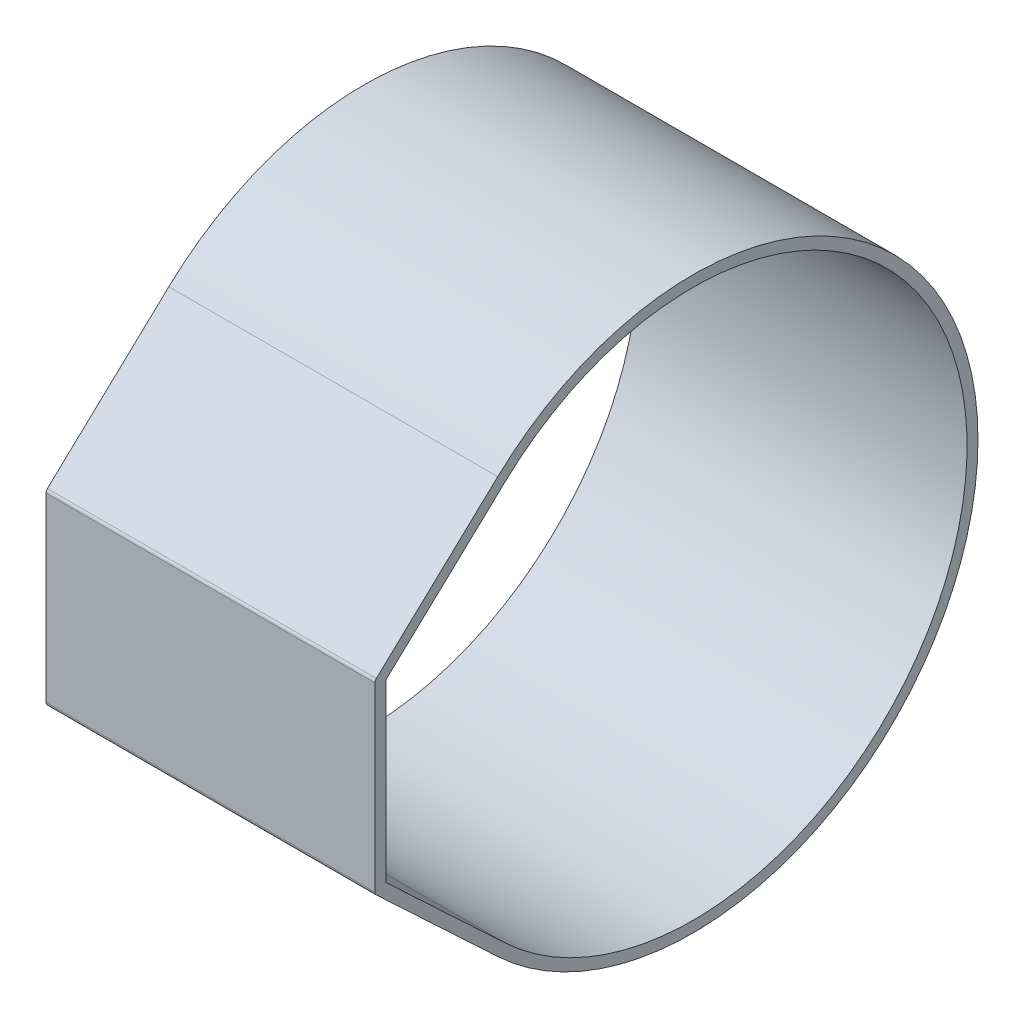
ISO-10303-21;
HEADER;
FILE_DESCRIPTION(('STEP AP214'),'2;1');
FILE_NAME('part.step','',(''),(''),'','','');
FILE_SCHEMA(('AUTOMOTIVE_DESIGN { 1 0 10303 214 1 1 1 1 }'));
ENDSEC;
DATA;
#1=APPLICATION_CONTEXT('core data for automotive mechanical design processes');
#2=APPLICATION_PROTOCOL_DEFINITION('international standard','automotive_design',2000,#1);
#3=PRODUCT_CONTEXT('',#1,'mechanical');
#4=PRODUCT('Part','Part','',(#3));
#5=PRODUCT_RELATED_PRODUCT_CATEGORY('part','',(#4));
#6=PRODUCT_DEFINITION_FORMATION('','',#4);
#7=PRODUCT_DEFINITION_CONTEXT('part definition',#1,'design');
#8=PRODUCT_DEFINITION('design','',#6,#7);
#9=PRODUCT_DEFINITION_SHAPE('','',#8);
#10=(LENGTH_UNIT() NAMED_UNIT(*) SI_UNIT(.MILLI.,.METRE.));
#11=(NAMED_UNIT(*) PLANE_ANGLE_UNIT() SI_UNIT($,.RADIAN.));
#12=(NAMED_UNIT(*) SI_UNIT($,.STERADIAN.) SOLID_ANGLE_UNIT());
#13=UNCERTAINTY_MEASURE_WITH_UNIT(LENGTH_MEASURE(1.E-05),#10,'distance_accuracy_value','');
#14=(GEOMETRIC_REPRESENTATION_CONTEXT(3) GLOBAL_UNCERTAINTY_ASSIGNED_CONTEXT((#13)) GLOBAL_UNIT_ASSIGNED_CONTEXT((#10,
#11,#12)) REPRESENTATION_CONTEXT('',''));
#15=CARTESIAN_POINT('',(0.,0.,0.));
#16=DIRECTION('',(0.,0.,1.));
#17=DIRECTION('',(1.,0.,0.));
#18=AXIS2_PLACEMENT_3D('',#15,#16,#17);
#19=CARTESIAN_POINT('',(139.007123161513,663.202201807785,-372.057743681072));
#20=DIRECTION('',(1.,0.,0.));
#21=DIRECTION('',(0.,1.,0.));
#22=AXIS2_PLACEMENT_3D('',#19,#20,#21);
#23=CYLINDRICAL_SURFACE('',#22,0.2);
#24=CARTESIAN_POINT('',(139.007123161513,663.202201807785,-372.057743681072));
#25=DIRECTION('',(1.,0.,0.));
#26=DIRECTION('',(0.,1.,0.));
#27=AXIS2_PLACEMENT_3D('',#24,#25,#26);
#28=CIRCLE('',#27,0.2);
#29=CARTESIAN_POINT('',(139.007123161513,663.202201807785,-371.857743681072));
#30=VERTEX_POINT('',#29);
#31=CARTESIAN_POINT('',(139.007123161513,663.056416626972,-371.920825161304));
#32=VERTEX_POINT('',#31);
#33=EDGE_CURVE('E20',#30,#32,#28,.T.);
#34=ORIENTED_EDGE('',*,*,#33,.T.);
#35=DIRECTION('',(1.,0.,0.));
#36=VECTOR('',#35,1.);
#37=CARTESIAN_POINT('',(139.007123161513,663.056416626972,-371.920825161304));
#38=LINE('',#37,#36);
#39=CARTESIAN_POINT('',(154.007123161513,663.056416626972,-371.920825161304));
#40=VERTEX_POINT('',#39);
#41=EDGE_CURVE('E88',#40,#32,#38,.F.);
#42=ORIENTED_EDGE('',*,*,#41,.F.);
#43=CARTESIAN_POINT('',(154.007123161513,663.202201807785,-372.057743681072));
#44=DIRECTION('',(1.,0.,0.));
#45=DIRECTION('',(0.,1.,0.));
#46=AXIS2_PLACEMENT_3D('',#43,#44,#45);
#47=CIRCLE('',#46,0.2);
#48=CARTESIAN_POINT('',(154.007123161513,663.202201807785,-371.857743681072));
#49=VERTEX_POINT('',#48);
#50=EDGE_CURVE('E136',#40,#49,#47,.F.);
#51=ORIENTED_EDGE('',*,*,#50,.T.);
#52=DIRECTION('',(1.,0.,0.));
#53=VECTOR('',#52,1.);
#54=CARTESIAN_POINT('',(139.007123161513,663.202201807785,-371.857743681072));
#55=LINE('',#54,#53);
#56=EDGE_CURVE('E91',#30,#49,#55,.T.);
#57=ORIENTED_EDGE('',*,*,#56,.F.);
#58=EDGE_LOOP('',(#34,#42,#51,#57));
#59=FACE_BOUND('',#58,.T.);
#60=ADVANCED_FACE('F17',(#59),#23,.T.);
#61=CARTESIAN_POINT('',(139.007123161513,663.11566148883,-371.857743681072));
#62=DIRECTION('',(0.,0.,1.));
#63=DIRECTION('',(1.,0.,0.));
#64=AXIS2_PLACEMENT_3D('',#61,#62,#63);
#65=PLANE('',#64);
#66=DIRECTION('',(0.,1.,0.));
#67=VECTOR('',#66,1.);
#68=CARTESIAN_POINT('',(139.007123161513,667.332012286217,-371.857743681072));
#69=LINE('',#68,#67);
#70=CARTESIAN_POINT('',(139.007123161513,671.46182276465,-371.857743681072));
#71=VERTEX_POINT('',#70);
#72=EDGE_CURVE('E98',#30,#71,#69,.T.);
#73=ORIENTED_EDGE('',*,*,#72,.F.);
#74=ORIENTED_EDGE('',*,*,#56,.T.);
#75=DIRECTION('',(0.,1.,0.));
#76=VECTOR('',#75,1.);
#77=CARTESIAN_POINT('',(154.007123161513,667.332012286217,-371.857743681072));
#78=LINE('',#77,#76);
#79=CARTESIAN_POINT('',(154.007123161513,671.46182276465,-371.857743681072));
#80=VERTEX_POINT('',#79);
#81=EDGE_CURVE('E133',#49,#80,#78,.T.);
#82=ORIENTED_EDGE('',*,*,#81,.T.);
#83=DIRECTION('',(1.,0.,0.));
#84=VECTOR('',#83,1.);
#85=CARTESIAN_POINT('',(139.007123161513,671.46182276465,-371.857743681072));
#86=LINE('',#85,#84);
#87=EDGE_CURVE('E148',#71,#80,#86,.T.);
#88=ORIENTED_EDGE('',*,*,#87,.F.);
#89=EDGE_LOOP('',(#73,#74,#82,#88));
#90=FACE_BOUND('',#89,.T.);
#91=ADVANCED_FACE('F176',(#90),#65,.T.);
#92=CARTESIAN_POINT('',(139.007123161513,663.332012286217,-372.357743681072));
#93=DIRECTION('',(0.,0.,1.));
#94=DIRECTION('',(1.,0.,0.));
#95=AXIS2_PLACEMENT_3D('',#92,#93,#94);
#96=PLANE('',#95);
#97=DIRECTION('',(1.,0.,0.));
#98=VECTOR('',#97,1.);
#99=CARTESIAN_POINT('',(139.007123161513,663.332012286217,-372.357743681072));
#100=LINE('',#99,#98);
#101=CARTESIAN_POINT('',(154.007123161513,663.332012286217,-372.357743681072));
#102=VERTEX_POINT('',#101);
#103=CARTESIAN_POINT('',(139.007123161513,663.332012286217,-372.357743681072));
#104=VERTEX_POINT('',#103);
#105=EDGE_CURVE('E154',#102,#104,#100,.F.);
#106=ORIENTED_EDGE('',*,*,#105,.T.);
#107=DIRECTION('',(0.,1.,0.));
#108=VECTOR('',#107,1.);
#109=CARTESIAN_POINT('',(139.007123161513,667.332012286217,-372.357743681072));
#110=LINE('',#109,#108);
#111=CARTESIAN_POINT('',(139.007123161513,671.332012286217,-372.357743681072));
#112=VERTEX_POINT('',#111);
#113=EDGE_CURVE('E103',#112,#104,#110,.F.);
#114=ORIENTED_EDGE('',*,*,#113,.F.);
#115=DIRECTION('',(1.,0.,0.));
#116=VECTOR('',#115,1.);
#117=CARTESIAN_POINT('',(139.007123161513,671.332012286217,-372.357743681072));
#118=LINE('',#117,#116);
#119=CARTESIAN_POINT('',(154.007123161513,671.332012286217,-372.357743681072));
#120=VERTEX_POINT('',#119);
#121=EDGE_CURVE('E144',#112,#120,#118,.T.);
#122=ORIENTED_EDGE('',*,*,#121,.T.);
#123=DIRECTION('',(0.,1.,0.));
#124=VECTOR('',#123,1.);
#125=CARTESIAN_POINT('',(154.007123161513,667.332012286217,-372.357743681072));
#126=LINE('',#125,#124);
#127=EDGE_CURVE('E130',#120,#102,#126,.F.);
#128=ORIENTED_EDGE('',*,*,#127,.T.);
#129=EDGE_LOOP('',(#106,#114,#122,#128));
#130=FACE_BOUND('',#129,.T.);
#131=ADVANCED_FACE('F217',(#130),#96,.F.);
#132=CARTESIAN_POINT('',(139.007123161513,658.220438485423,-377.800336195585));
#133=DIRECTION('',(0.,-0.728925904063566,0.684592598838983));
#134=DIRECTION('',(0.,-0.684592598838983,-0.728925904063566));
#135=AXIS2_PLACEMENT_3D('',#132,#133,#134);
#136=PLANE('',#135);
#137=DIRECTION('',(1.,0.,0.));
#138=VECTOR('',#137,1.);
#139=CARTESIAN_POINT('',(139.007123161513,658.220438485423,-377.800336195585));
#140=LINE('',#139,#138);
#141=CARTESIAN_POINT('',(154.007123161513,658.220438485422,-377.800336195585));
#142=VERTEX_POINT('',#141);
#143=CARTESIAN_POINT('',(139.007123161513,658.220438485422,-377.800336195585));
#144=VERTEX_POINT('',#143);
#145=EDGE_CURVE('E145',#142,#144,#140,.F.);
#146=ORIENTED_EDGE('',*,*,#145,.T.);
#147=DIRECTION('',(0.,-0.684592598838925,-0.728925904063621));
#148=VECTOR('',#147,1.);
#149=CARTESIAN_POINT('',(139.007123161513,663.332012286217,-372.357743681072));
#150=LINE('',#149,#148);
#151=EDGE_CURVE('E107',#104,#144,#150,.T.);
#152=ORIENTED_EDGE('',*,*,#151,.F.);
#153=ORIENTED_EDGE('',*,*,#105,.F.);
#154=DIRECTION('',(0.,-0.684592598838925,-0.728925904063621));
#155=VECTOR('',#154,1.);
#156=CARTESIAN_POINT('',(154.007123161513,663.332012286217,-372.357743681072));
#157=LINE('',#156,#155);
#158=EDGE_CURVE('E128',#102,#142,#157,.T.);
#159=ORIENTED_EDGE('',*,*,#158,.T.);
#160=EDGE_LOOP('',(#146,#152,#153,#159));
#161=FACE_BOUND('',#160,.T.);
#162=ADVANCED_FACE('F213',(#161),#136,.F.);
#163=CARTESIAN_POINT('',(139.007123161513,667.332012286217,-386.357743681072));
#164=DIRECTION('',(1.,0.,0.));
#165=DIRECTION('',(0.,1.,0.));
#166=AXIS2_PLACEMENT_3D('',#163,#164,#165);
#167=CYLINDRICAL_SURFACE('',#166,12.4999999999999);
#168=DIRECTION('',(1.,0.,0.));
#169=VECTOR('',#168,1.);
#170=CARTESIAN_POINT('',(139.007123161513,676.443586087012,-377.800336195585));
#171=LINE('',#170,#169);
#172=CARTESIAN_POINT('',(154.007123161513,676.443586087012,-377.800336195585));
#173=VERTEX_POINT('',#172);
#174=CARTESIAN_POINT('',(139.007123161513,676.443586087012,-377.800336195585));
#175=VERTEX_POINT('',#174);
#176=EDGE_CURVE('E142',#173,#175,#171,.F.);
#177=ORIENTED_EDGE('',*,*,#176,.T.);
#178=CARTESIAN_POINT('',(139.007123161513,667.332012286217,-386.357743681072));
#179=DIRECTION('',(1.,0.,0.));
#180=DIRECTION('',(0.,1.,0.));
#181=AXIS2_PLACEMENT_3D('',#178,#179,#180);
#182=CIRCLE('',#181,12.4999999999999);
#183=EDGE_CURVE('E169',#144,#175,#182,.T.);
#184=ORIENTED_EDGE('',*,*,#183,.F.);
#185=ORIENTED_EDGE('',*,*,#145,.F.);
#186=CARTESIAN_POINT('',(154.007123161513,667.332012286217,-386.357743681072));
#187=DIRECTION('',(1.,0.,0.));
#188=DIRECTION('',(0.,1.,0.));
#189=AXIS2_PLACEMENT_3D('',#186,#187,#188);
#190=CIRCLE('',#189,12.4999999999999);
#191=EDGE_CURVE('E125',#142,#173,#190,.T.);
#192=ORIENTED_EDGE('',*,*,#191,.T.);
#193=EDGE_LOOP('',(#177,#184,#185,#192));
#194=FACE_BOUND('',#193,.T.);
#195=ADVANCED_FACE('F209',(#194),#167,.F.);
#196=CARTESIAN_POINT('',(139.007123161513,671.332012286217,-372.357743681072));
#197=DIRECTION('',(0.,0.728925904063566,0.684592598838983));
#198=DIRECTION('',(0.,-0.684592598838983,0.728925904063566));
#199=AXIS2_PLACEMENT_3D('',#196,#197,#198);
#200=PLANE('',#199);
#201=ORIENTED_EDGE('',*,*,#121,.F.);
#202=DIRECTION('',(0.,-0.684592598838988,0.728925904063562));
#203=VECTOR('',#202,1.);
#204=CARTESIAN_POINT('',(139.007123161513,676.443586087012,-377.800336195585));
#205=LINE('',#204,#203);
#206=EDGE_CURVE('E139',#175,#112,#205,.T.);
#207=ORIENTED_EDGE('',*,*,#206,.F.);
#208=ORIENTED_EDGE('',*,*,#176,.F.);
#209=DIRECTION('',(0.,-0.684592598838988,0.728925904063562));
#210=VECTOR('',#209,1.);
#211=CARTESIAN_POINT('',(154.007123161513,676.443586087012,-377.800336195585));
#212=LINE('',#211,#210);
#213=EDGE_CURVE('E122',#173,#120,#212,.T.);
#214=ORIENTED_EDGE('',*,*,#213,.T.);
#215=EDGE_LOOP('',(#201,#207,#208,#214));
#216=FACE_BOUND('',#215,.T.);
#217=ADVANCED_FACE('F206',(#216),#200,.F.);
#218=CARTESIAN_POINT('',(139.007123161513,671.46182276465,-372.057743681072));
#219=DIRECTION('',(1.,0.,0.));
#220=DIRECTION('',(0.,1.,0.));
#221=AXIS2_PLACEMENT_3D('',#218,#219,#220);
#222=CYLINDRICAL_SURFACE('',#221,0.2);
#223=CARTESIAN_POINT('',(139.007123161513,671.46182276465,-372.057743681072));
#224=DIRECTION('',(1.,0.,0.));
#225=DIRECTION('',(0.,1.,0.));
#226=AXIS2_PLACEMENT_3D('',#223,#224,#225);
#227=CIRCLE('',#226,0.2);
#228=CARTESIAN_POINT('',(139.007123161513,671.607607945463,-371.920825161304));
#229=VERTEX_POINT('',#228);
#230=EDGE_CURVE('E104',#71,#229,#227,.F.);
#231=ORIENTED_EDGE('',*,*,#230,.F.);
#232=ORIENTED_EDGE('',*,*,#87,.T.);
#233=CARTESIAN_POINT('',(154.007123161513,671.46182276465,-372.057743681072));
#234=DIRECTION('',(1.,0.,0.));
#235=DIRECTION('',(0.,1.,0.));
#236=AXIS2_PLACEMENT_3D('',#233,#234,#235);
#237=CIRCLE('',#236,0.2);
#238=CARTESIAN_POINT('',(154.007123161513,671.607607945463,-371.920825161304));
#239=VERTEX_POINT('',#238);
#240=EDGE_CURVE('E135',#80,#239,#237,.F.);
#241=ORIENTED_EDGE('',*,*,#240,.T.);
#242=DIRECTION('',(1.,0.,0.));
#243=VECTOR('',#242,1.);
#244=CARTESIAN_POINT('',(139.007123161513,671.607607945463,-371.920825161304));
#245=LINE('',#244,#243);
#246=EDGE_CURVE('E119',#229,#239,#245,.T.);
#247=ORIENTED_EDGE('',*,*,#246,.F.);
#248=EDGE_LOOP('',(#231,#232,#241,#247));
#249=FACE_BOUND('',#248,.T.);
#250=ADVANCED_FACE('F183',(#249),#222,.T.);
#251=CARTESIAN_POINT('',(154.007123161513,667.332012286217,-384.802410743488));
#252=DIRECTION('',(-1.,0.,0.));
#253=DIRECTION('',(0.,0.,1.));
#254=AXIS2_PLACEMENT_3D('',#251,#252,#253);
#255=PLANE('',#254);
#256=ORIENTED_EDGE('',*,*,#191,.F.);
#257=ORIENTED_EDGE('',*,*,#158,.F.);
#258=ORIENTED_EDGE('',*,*,#127,.F.);
#259=ORIENTED_EDGE('',*,*,#213,.F.);
#260=EDGE_LOOP('',(#256,#257,#258,#259));
#261=FACE_BOUND('',#260,.T.);
#262=CARTESIAN_POINT('',(154.007123161513,667.332012286217,-386.357743681072));
#263=DIRECTION('',(1.,0.,0.));
#264=DIRECTION('',(0.,1.,0.));
#265=AXIS2_PLACEMENT_3D('',#262,#263,#264);
#266=CIRCLE('',#265,12.9999999999999);
#267=CARTESIAN_POINT('',(154.007123161513,676.808049039044,-377.458039896165));
#268=VERTEX_POINT('',#267);
#269=CARTESIAN_POINT('',(154.007123161513,657.855975533391,-377.458039896165));
#270=VERTEX_POINT('',#269);
#271=EDGE_CURVE('E116',#268,#270,#266,.F.);
#272=ORIENTED_EDGE('',*,*,#271,.F.);
#273=DIRECTION('',(0.,-0.684592598838981,0.728925904063568));
#274=VECTOR('',#273,1.);
#275=CARTESIAN_POINT('',(154.007123161513,671.548363083605,-371.857743681072));
#276=LINE('',#275,#274);
#277=EDGE_CURVE('E120',#239,#268,#276,.F.);
#278=ORIENTED_EDGE('',*,*,#277,.F.);
#279=ORIENTED_EDGE('',*,*,#240,.F.);
#280=ORIENTED_EDGE('',*,*,#81,.F.);
#281=ORIENTED_EDGE('',*,*,#50,.F.);
#282=DIRECTION('',(0.,-0.684592598838981,-0.728925904063568));
#283=VECTOR('',#282,1.);
#284=CARTESIAN_POINT('',(154.007123161513,657.855975533391,-377.458039896165));
#285=LINE('',#284,#283);
#286=EDGE_CURVE('E97',#270,#40,#285,.F.);
#287=ORIENTED_EDGE('',*,*,#286,.F.);
#288=EDGE_LOOP('',(#272,#278,#279,#280,#281,#287));
#289=FACE_BOUND('',#288,.T.);
#290=ADVANCED_FACE('F178',(#261,#289),#255,.F.);
#291=CARTESIAN_POINT('',(139.007123161513,657.855975533391,-377.458039896165));
#292=DIRECTION('',(0.,-0.728925904063568,0.684592598838981));
#293=DIRECTION('',(0.,-0.684592598838981,-0.728925904063568));
#294=AXIS2_PLACEMENT_3D('',#291,#292,#293);
#295=PLANE('',#294);
#296=DIRECTION('',(0.,0.68459259883897,0.728925904063578));
#297=VECTOR('',#296,1.);
#298=CARTESIAN_POINT('',(139.007123161513,657.855975533391,-377.458039896165));
#299=LINE('',#298,#297);
#300=CARTESIAN_POINT('',(139.007123161513,657.855975533391,-377.458039896165));
#301=VERTEX_POINT('',#300);
#302=EDGE_CURVE('E96',#301,#32,#299,.T.);
#303=ORIENTED_EDGE('',*,*,#302,.F.);
#304=DIRECTION('',(1.,0.,0.));
#305=VECTOR('',#304,1.);
#306=CARTESIAN_POINT('',(139.007123161513,657.855975533391,-377.458039896165));
#307=LINE('',#306,#305);
#308=EDGE_CURVE('E115',#270,#301,#307,.F.);
#309=ORIENTED_EDGE('',*,*,#308,.F.);
#310=ORIENTED_EDGE('',*,*,#286,.T.);
#311=ORIENTED_EDGE('',*,*,#41,.T.);
#312=EDGE_LOOP('',(#303,#309,#310,#311));
#313=FACE_BOUND('',#312,.T.);
#314=ADVANCED_FACE('F94',(#313),#295,.T.);
#315=CARTESIAN_POINT('',(139.007123161513,667.332012286217,-384.802410743488));
#316=DIRECTION('',(-1.,0.,0.));
#317=DIRECTION('',(0.,0.,1.));
#318=AXIS2_PLACEMENT_3D('',#315,#316,#317);
#319=PLANE('',#318);
#320=ORIENTED_EDGE('',*,*,#183,.T.);
#321=ORIENTED_EDGE('',*,*,#206,.T.);
#322=ORIENTED_EDGE('',*,*,#113,.T.);
#323=ORIENTED_EDGE('',*,*,#151,.T.);
#324=EDGE_LOOP('',(#320,#321,#322,#323));
#325=FACE_BOUND('',#324,.T.);
#326=CARTESIAN_POINT('',(139.007123161513,667.332012286217,-386.357743681072));
#327=DIRECTION('',(1.,0.,0.));
#328=DIRECTION('',(0.,1.,0.));
#329=AXIS2_PLACEMENT_3D('',#326,#327,#328);
#330=CIRCLE('',#329,12.9999999999999);
#331=CARTESIAN_POINT('',(139.007123161513,676.808049039044,-377.458039896165));
#332=VERTEX_POINT('',#331);
#333=EDGE_CURVE('E26',#301,#332,#330,.T.);
#334=ORIENTED_EDGE('',*,*,#333,.F.);
#335=ORIENTED_EDGE('',*,*,#302,.T.);
#336=ORIENTED_EDGE('',*,*,#33,.F.);
#337=ORIENTED_EDGE('',*,*,#72,.T.);
#338=ORIENTED_EDGE('',*,*,#230,.T.);
#339=DIRECTION('',(0.,-0.684592598838981,0.728925904063568));
#340=VECTOR('',#339,1.);
#341=CARTESIAN_POINT('',(139.007123161513,671.548363083605,-371.857743681072));
#342=LINE('',#341,#340);
#343=EDGE_CURVE('E35',#332,#229,#342,.T.);
#344=ORIENTED_EDGE('',*,*,#343,.F.);
#345=EDGE_LOOP('',(#334,#335,#336,#337,#338,#344));
#346=FACE_BOUND('',#345,.T.);
#347=ADVANCED_FACE('F100',(#325,#346),#319,.T.);
#348=CARTESIAN_POINT('',(139.007123161513,671.548363083605,-371.857743681072));
#349=DIRECTION('',(0.,0.728925904063568,0.684592598838981));
#350=DIRECTION('',(0.,-0.684592598838981,0.728925904063568));
#351=AXIS2_PLACEMENT_3D('',#348,#349,#350);
#352=PLANE('',#351);
#353=ORIENTED_EDGE('',*,*,#343,.T.);
#354=ORIENTED_EDGE('',*,*,#246,.T.);
#355=ORIENTED_EDGE('',*,*,#277,.T.);
#356=DIRECTION('',(1.,0.,0.));
#357=VECTOR('',#356,1.);
#358=CARTESIAN_POINT('',(139.007123161513,676.808049039044,-377.458039896165));
#359=LINE('',#358,#357);
#360=EDGE_CURVE('E11',#332,#268,#359,.T.);
#361=ORIENTED_EDGE('',*,*,#360,.F.);
#362=EDGE_LOOP('',(#353,#354,#355,#361));
#363=FACE_BOUND('',#362,.T.);
#364=ADVANCED_FACE('F185',(#363),#352,.T.);
#365=CARTESIAN_POINT('',(139.007123161513,667.332012286217,-386.357743681072));
#366=DIRECTION('',(1.,0.,0.));
#367=DIRECTION('',(0.,1.,0.));
#368=AXIS2_PLACEMENT_3D('',#365,#366,#367);
#369=CYLINDRICAL_SURFACE('',#368,12.9999999999999);
#370=ORIENTED_EDGE('',*,*,#333,.T.);
#371=ORIENTED_EDGE('',*,*,#360,.T.);
#372=ORIENTED_EDGE('',*,*,#271,.T.);
#373=ORIENTED_EDGE('',*,*,#308,.T.);
#374=EDGE_LOOP('',(#370,#371,#372,#373));
#375=FACE_BOUND('',#374,.T.);
#376=ADVANCED_FACE('F187',(#375),#369,.T.);
#377=CLOSED_SHELL('',(#60,#91,#131,#162,#195,#217,#250,#290,#314,#347,#364,#376));
#378=MANIFOLD_SOLID_BREP('B1',#377);
#379=ADVANCED_BREP_SHAPE_REPRESENTATION('',(#18,#378),#14);
#380=SHAPE_DEFINITION_REPRESENTATION(#9,#379);
ENDSEC;
END-ISO-10303-21;
